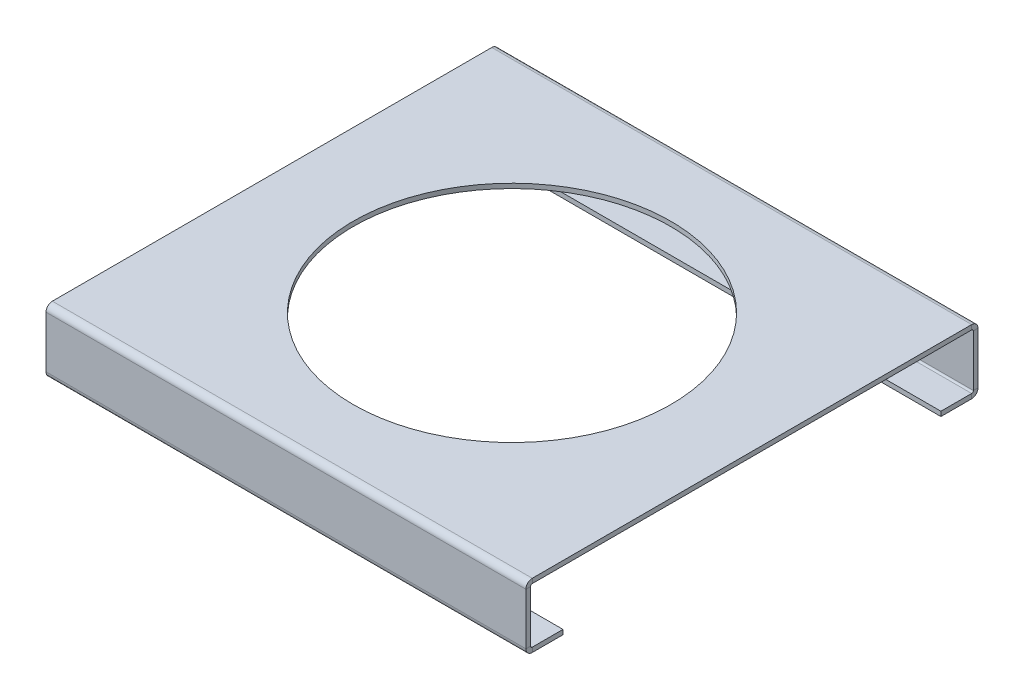
ISO-10303-21;
HEADER;
FILE_DESCRIPTION(('STEP AP214'),'2;1');
FILE_NAME('part.step','',(''),(''),'','','');
FILE_SCHEMA(('AUTOMOTIVE_DESIGN { 1 0 10303 214 1 1 1 1 }'));
ENDSEC;
DATA;
#1=APPLICATION_CONTEXT('core data for automotive mechanical design processes');
#2=APPLICATION_PROTOCOL_DEFINITION('international standard','automotive_design',2000,#1);
#3=PRODUCT_CONTEXT('',#1,'mechanical');
#4=PRODUCT('Part','Part','',(#3));
#5=PRODUCT_RELATED_PRODUCT_CATEGORY('part','',(#4));
#6=PRODUCT_DEFINITION_FORMATION('','',#4);
#7=PRODUCT_DEFINITION_CONTEXT('part definition',#1,'design');
#8=PRODUCT_DEFINITION('design','',#6,#7);
#9=PRODUCT_DEFINITION_SHAPE('','',#8);
#10=(LENGTH_UNIT() NAMED_UNIT(*) SI_UNIT(.MILLI.,.METRE.));
#11=(NAMED_UNIT(*) PLANE_ANGLE_UNIT() SI_UNIT($,.RADIAN.));
#12=(NAMED_UNIT(*) SI_UNIT($,.STERADIAN.) SOLID_ANGLE_UNIT());
#13=UNCERTAINTY_MEASURE_WITH_UNIT(LENGTH_MEASURE(1.E-05),#10,'distance_accuracy_value','');
#14=(GEOMETRIC_REPRESENTATION_CONTEXT(3) GLOBAL_UNCERTAINTY_ASSIGNED_CONTEXT((#13)) GLOBAL_UNIT_ASSIGNED_CONTEXT((#10,
#11,#12)) REPRESENTATION_CONTEXT('',''));
#15=CARTESIAN_POINT('',(0.,0.,0.));
#16=DIRECTION('',(0.,0.,1.));
#17=DIRECTION('',(1.,0.,0.));
#18=AXIS2_PLACEMENT_3D('',#15,#16,#17);
#19=CARTESIAN_POINT('',(0.,-2.,0.));
#20=DIRECTION('',(0.,1.,0.));
#21=DIRECTION('',(0.,0.,1.));
#22=AXIS2_PLACEMENT_3D('',#19,#20,#21);
#23=PLANE('',#22);
#24=CARTESIAN_POINT('',(-1.35489248208037,-2.,0.135489248208026));
#25=DIRECTION('',(0.,1.,0.));
#26=DIRECTION('',(0.,0.,1.));
#27=AXIS2_PLACEMENT_3D('',#24,#25,#26);
#28=CIRCLE('',#27,68.5);
#29=CARTESIAN_POINT('',(-1.35489248208037,-2.,68.635489248208));
#30=VERTEX_POINT('',#29);
#31=EDGE_CURVE('E353',#30,#30,#28,.T.);
#32=ORIENTED_EDGE('',*,*,#31,.T.);
#33=EDGE_LOOP('',(#32));
#34=FACE_BOUND('',#33,.T.);
#35=DIRECTION('',(1.,0.,0.));
#36=VECTOR('',#35,1.);
#37=CARTESIAN_POINT('',(102.14510751792,-2.00000000000001,-94.627910751792));
#38=LINE('',#37,#36);
#39=CARTESIAN_POINT('',(102.14510751792,-2.00000000000001,-94.627910751792));
#40=VERTEX_POINT('',#39);
#41=CARTESIAN_POINT('',(-104.85489248208,-2.00000000000001,-94.627910751792));
#42=VERTEX_POINT('',#41);
#43=EDGE_CURVE('E402',#40,#42,#38,.F.);
#44=ORIENTED_EDGE('',*,*,#43,.F.);
#45=DIRECTION('',(0.,0.,-1.));
#46=VECTOR('',#45,1.);
#47=CARTESIAN_POINT('',(102.14510751792,-2.,97.635489248208));
#48=LINE('',#47,#46);
#49=CARTESIAN_POINT('',(102.14510751792,-2.00000000000001,94.898889248208));
#50=VERTEX_POINT('',#49);
#51=EDGE_CURVE('E126',#50,#40,#48,.T.);
#52=ORIENTED_EDGE('',*,*,#51,.F.);
#53=DIRECTION('',(-1.,0.,0.));
#54=VECTOR('',#53,1.);
#55=CARTESIAN_POINT('',(-104.85489248208,-2.00000000000001,94.898889248208));
#56=LINE('',#55,#54);
#57=CARTESIAN_POINT('',(-104.85489248208,-2.00000000000001,94.898889248208));
#58=VERTEX_POINT('',#57);
#59=EDGE_CURVE('E454',#58,#50,#56,.F.);
#60=ORIENTED_EDGE('',*,*,#59,.F.);
#61=DIRECTION('',(0.,0.,1.));
#62=VECTOR('',#61,1.);
#63=CARTESIAN_POINT('',(-104.85489248208,-2.,-97.364510751792));
#64=LINE('',#63,#62);
#65=EDGE_CURVE('E13',#42,#58,#64,.T.);
#66=ORIENTED_EDGE('',*,*,#65,.F.);
#67=EDGE_LOOP('',(#44,#52,#60,#66));
#68=FACE_BOUND('',#67,.T.);
#69=ADVANCED_FACE('F117',(#34,#68),#23,.F.);
#70=CARTESIAN_POINT('',(0.,0.,0.));
#71=DIRECTION('',(0.,1.,0.));
#72=DIRECTION('',(0.,0.,1.));
#73=AXIS2_PLACEMENT_3D('',#70,#71,#72);
#74=PLANE('',#73);
#75=CARTESIAN_POINT('',(-1.35489248208037,0.,0.135489248208026));
#76=DIRECTION('',(0.,1.,0.));
#77=DIRECTION('',(0.,0.,1.));
#78=AXIS2_PLACEMENT_3D('',#75,#76,#77);
#79=CIRCLE('',#78,68.5);
#80=CARTESIAN_POINT('',(-1.35489248208037,0.,68.635489248208));
#81=VERTEX_POINT('',#80);
#82=EDGE_CURVE('E344',#81,#81,#79,.T.);
#83=ORIENTED_EDGE('',*,*,#82,.F.);
#84=EDGE_LOOP('',(#83));
#85=FACE_BOUND('',#84,.T.);
#86=DIRECTION('',(0.,0.,-1.));
#87=VECTOR('',#86,1.);
#88=CARTESIAN_POINT('',(102.14510751792,0.,97.635489248208));
#89=LINE('',#88,#87);
#90=CARTESIAN_POINT('',(102.14510751792,0.,94.898889248208));
#91=VERTEX_POINT('',#90);
#92=CARTESIAN_POINT('',(102.14510751792,0.,-94.627910751792));
#93=VERTEX_POINT('',#92);
#94=EDGE_CURVE('E460',#91,#93,#89,.T.);
#95=ORIENTED_EDGE('',*,*,#94,.T.);
#96=DIRECTION('',(1.,0.,0.));
#97=VECTOR('',#96,1.);
#98=CARTESIAN_POINT('',(102.14510751792,0.,-94.627910751792));
#99=LINE('',#98,#97);
#100=CARTESIAN_POINT('',(-104.85489248208,0.,-94.627910751792));
#101=VERTEX_POINT('',#100);
#102=EDGE_CURVE('E391',#93,#101,#99,.F.);
#103=ORIENTED_EDGE('',*,*,#102,.T.);
#104=DIRECTION('',(0.,0.,1.));
#105=VECTOR('',#104,1.);
#106=CARTESIAN_POINT('',(-104.85489248208,0.,-97.364510751792));
#107=LINE('',#106,#105);
#108=CARTESIAN_POINT('',(-104.85489248208,0.,94.898889248208));
#109=VERTEX_POINT('',#108);
#110=EDGE_CURVE('E121',#101,#109,#107,.T.);
#111=ORIENTED_EDGE('',*,*,#110,.T.);
#112=DIRECTION('',(-1.,0.,0.));
#113=VECTOR('',#112,1.);
#114=CARTESIAN_POINT('',(-104.85489248208,0.,94.898889248208));
#115=LINE('',#114,#113);
#116=EDGE_CURVE('E443',#109,#91,#115,.F.);
#117=ORIENTED_EDGE('',*,*,#116,.T.);
#118=EDGE_LOOP('',(#95,#103,#111,#117));
#119=FACE_BOUND('',#118,.T.);
#120=ADVANCED_FACE('F469',(#85,#119),#74,.T.);
#121=CARTESIAN_POINT('',(102.14510751792,-2.,97.635489248208));
#122=DIRECTION('',(1.,0.,0.));
#123=DIRECTION('',(0.,0.,-1.));
#124=AXIS2_PLACEMENT_3D('',#121,#122,#123);
#125=PLANE('',#124);
#126=ORIENTED_EDGE('',*,*,#51,.T.);
#127=DIRECTION('',(0.,1.,0.));
#128=VECTOR('',#127,1.);
#129=CARTESIAN_POINT('',(102.14510751792,-2.00000000000001,-94.627910751792));
#130=LINE('',#129,#128);
#131=EDGE_CURVE('E396',#40,#93,#130,.T.);
#132=ORIENTED_EDGE('',*,*,#131,.T.);
#133=ORIENTED_EDGE('',*,*,#94,.F.);
#134=DIRECTION('',(0.,1.,0.));
#135=VECTOR('',#134,1.);
#136=CARTESIAN_POINT('',(102.14510751792,-2.00000000000001,94.898889248208));
#137=LINE('',#136,#135);
#138=EDGE_CURVE('E458',#50,#91,#137,.T.);
#139=ORIENTED_EDGE('',*,*,#138,.F.);
#140=EDGE_LOOP('',(#126,#132,#133,#139));
#141=FACE_BOUND('',#140,.T.);
#142=ADVANCED_FACE('F119',(#141),#125,.T.);
#143=CARTESIAN_POINT('',(-104.85489248208,-2.,-97.364510751792));
#144=DIRECTION('',(-1.,0.,0.));
#145=DIRECTION('',(0.,0.,1.));
#146=AXIS2_PLACEMENT_3D('',#143,#144,#145);
#147=PLANE('',#146);
#148=DIRECTION('',(0.,1.,0.));
#149=VECTOR('',#148,1.);
#150=CARTESIAN_POINT('',(-104.85489248208,-2.00000000000001,-94.627910751792));
#151=LINE('',#150,#149);
#152=EDGE_CURVE('E406',#42,#101,#151,.T.);
#153=ORIENTED_EDGE('',*,*,#152,.F.);
#154=ORIENTED_EDGE('',*,*,#65,.T.);
#155=DIRECTION('',(0.,1.,0.));
#156=VECTOR('',#155,1.);
#157=CARTESIAN_POINT('',(-104.85489248208,-2.00000000000001,94.898889248208));
#158=LINE('',#157,#156);
#159=EDGE_CURVE('E448',#58,#109,#158,.T.);
#160=ORIENTED_EDGE('',*,*,#159,.T.);
#161=ORIENTED_EDGE('',*,*,#110,.F.);
#162=EDGE_LOOP('',(#153,#154,#160,#161));
#163=FACE_BOUND('',#162,.T.);
#164=ADVANCED_FACE('F472',(#163),#147,.T.);
#165=CARTESIAN_POINT('',(102.14510751792,-2.73660000000001,94.898889248208));
#166=DIRECTION('',(1.,0.,0.));
#167=DIRECTION('',(0.,0.,-1.));
#168=AXIS2_PLACEMENT_3D('',#165,#166,#167);
#169=PLANE('',#168);
#170=DIRECTION('',(0.,0.,-1.));
#171=VECTOR('',#170,1.);
#172=CARTESIAN_POINT('',(102.14510751792,-2.73660000000001,97.635489248208));
#173=LINE('',#172,#171);
#174=CARTESIAN_POINT('',(102.14510751792,-2.73660000000001,95.635489248208));
#175=VERTEX_POINT('',#174);
#176=CARTESIAN_POINT('',(102.14510751792,-2.7366,97.635489248208));
#177=VERTEX_POINT('',#176);
#178=EDGE_CURVE('E408',#175,#177,#173,.F.);
#179=ORIENTED_EDGE('',*,*,#178,.F.);
#180=CARTESIAN_POINT('',(102.14510751792,-2.73660000000001,94.898889248208));
#181=DIRECTION('',(-1.,0.,0.));
#182=DIRECTION('',(0.,0.,1.));
#183=AXIS2_PLACEMENT_3D('',#180,#181,#182);
#184=CIRCLE('',#183,0.736600000000004);
#185=EDGE_CURVE('E451',#50,#175,#184,.F.);
#186=ORIENTED_EDGE('',*,*,#185,.F.);
#187=ORIENTED_EDGE('',*,*,#138,.T.);
#188=CARTESIAN_POINT('',(102.14510751792,-2.73660000000001,94.898889248208));
#189=DIRECTION('',(-1.,0.,0.));
#190=DIRECTION('',(0.,0.,1.));
#191=AXIS2_PLACEMENT_3D('',#188,#189,#190);
#192=CIRCLE('',#191,2.7366);
#193=EDGE_CURVE('E134',#91,#177,#192,.F.);
#194=ORIENTED_EDGE('',*,*,#193,.T.);
#195=EDGE_LOOP('',(#179,#186,#187,#194));
#196=FACE_BOUND('',#195,.T.);
#197=ADVANCED_FACE('F550',(#196),#169,.T.);
#198=CARTESIAN_POINT('',(-104.85489248208,-2.73660000000001,94.898889248208));
#199=DIRECTION('',(1.,0.,0.));
#200=DIRECTION('',(0.,0.,-1.));
#201=AXIS2_PLACEMENT_3D('',#198,#199,#200);
#202=PLANE('',#201);
#203=CARTESIAN_POINT('',(-104.85489248208,-2.73660000000001,94.898889248208));
#204=DIRECTION('',(-1.,0.,0.));
#205=DIRECTION('',(0.,0.,1.));
#206=AXIS2_PLACEMENT_3D('',#203,#204,#205);
#207=CIRCLE('',#206,0.736600000000004);
#208=CARTESIAN_POINT('',(-104.85489248208,-2.73660000000001,95.635489248208));
#209=VERTEX_POINT('',#208);
#210=EDGE_CURVE('E413',#209,#58,#207,.T.);
#211=ORIENTED_EDGE('',*,*,#210,.F.);
#212=DIRECTION('',(0.,0.,-1.));
#213=VECTOR('',#212,1.);
#214=CARTESIAN_POINT('',(-104.85489248208,-2.73660000000002,95.635489248208));
#215=LINE('',#214,#213);
#216=CARTESIAN_POINT('',(-104.85489248208,-2.73660000000002,97.635489248208));
#217=VERTEX_POINT('',#216);
#218=EDGE_CURVE('E436',#209,#217,#215,.F.);
#219=ORIENTED_EDGE('',*,*,#218,.T.);
#220=CARTESIAN_POINT('',(-104.85489248208,-2.73660000000001,94.898889248208));
#221=DIRECTION('',(-1.,0.,0.));
#222=DIRECTION('',(0.,0.,1.));
#223=AXIS2_PLACEMENT_3D('',#220,#221,#222);
#224=CIRCLE('',#223,2.7366);
#225=EDGE_CURVE('E446',#217,#109,#224,.T.);
#226=ORIENTED_EDGE('',*,*,#225,.T.);
#227=ORIENTED_EDGE('',*,*,#159,.F.);
#228=EDGE_LOOP('',(#211,#219,#226,#227));
#229=FACE_BOUND('',#228,.T.);
#230=ADVANCED_FACE('F477',(#229),#202,.F.);
#231=CARTESIAN_POINT('',(-104.85489248208,-2.73660000000001,94.898889248208));
#232=DIRECTION('',(-1.,0.,0.));
#233=DIRECTION('',(0.,0.,1.));
#234=AXIS2_PLACEMENT_3D('',#231,#232,#233);
#235=CYLINDRICAL_SURFACE('',#234,2.7366);
#236=ORIENTED_EDGE('',*,*,#116,.F.);
#237=ORIENTED_EDGE('',*,*,#225,.F.);
#238=DIRECTION('',(-1.,0.,0.));
#239=VECTOR('',#238,1.);
#240=CARTESIAN_POINT('',(102.14510751792,-2.73660000000001,97.635489248208));
#241=LINE('',#240,#239);
#242=EDGE_CURVE('E434',#217,#177,#241,.F.);
#243=ORIENTED_EDGE('',*,*,#242,.T.);
#244=ORIENTED_EDGE('',*,*,#193,.F.);
#245=EDGE_LOOP('',(#236,#237,#243,#244));
#246=FACE_BOUND('',#245,.T.);
#247=ADVANCED_FACE('F631',(#246),#235,.T.);
#248=CARTESIAN_POINT('',(-104.85489248208,-2.73660000000001,94.898889248208));
#249=DIRECTION('',(-1.,0.,0.));
#250=DIRECTION('',(0.,0.,1.));
#251=AXIS2_PLACEMENT_3D('',#248,#249,#250);
#252=CYLINDRICAL_SURFACE('',#251,0.736600000000004);
#253=ORIENTED_EDGE('',*,*,#59,.T.);
#254=ORIENTED_EDGE('',*,*,#185,.T.);
#255=DIRECTION('',(-1.,0.,0.));
#256=VECTOR('',#255,1.);
#257=CARTESIAN_POINT('',(102.14510751792,-2.73660000000001,95.635489248208));
#258=LINE('',#257,#256);
#259=EDGE_CURVE('E439',#175,#209,#258,.T.);
#260=ORIENTED_EDGE('',*,*,#259,.T.);
#261=ORIENTED_EDGE('',*,*,#210,.T.);
#262=EDGE_LOOP('',(#253,#254,#260,#261));
#263=FACE_BOUND('',#262,.T.);
#264=ADVANCED_FACE('F480',(#263),#252,.F.);
#265=CARTESIAN_POINT('',(-104.85489248208,-25.,97.6354892482081));
#266=DIRECTION('',(1.,0.,0.));
#267=DIRECTION('',(0.,0.,-1.));
#268=AXIS2_PLACEMENT_3D('',#265,#266,#267);
#269=PLANE('',#268);
#270=ORIENTED_EDGE('',*,*,#218,.F.);
#271=DIRECTION('',(0.,1.,0.));
#272=VECTOR('',#271,1.);
#273=CARTESIAN_POINT('',(-104.85489248208,-25.,95.6354892482081));
#274=LINE('',#273,#272);
#275=CARTESIAN_POINT('',(-104.85489248208,-25.,95.6354892482081));
#276=VERTEX_POINT('',#275);
#277=EDGE_CURVE('E431',#209,#276,#274,.F.);
#278=ORIENTED_EDGE('',*,*,#277,.T.);
#279=DIRECTION('',(0.,0.,-1.));
#280=VECTOR('',#279,1.);
#281=CARTESIAN_POINT('',(-104.85489248208,-25.,97.6354892482081));
#282=LINE('',#281,#280);
#283=CARTESIAN_POINT('',(-104.85489248208,-25.,97.6354892482081));
#284=VERTEX_POINT('',#283);
#285=EDGE_CURVE('E411',#284,#276,#282,.T.);
#286=ORIENTED_EDGE('',*,*,#285,.F.);
#287=DIRECTION('',(0.,-1.,0.));
#288=VECTOR('',#287,1.);
#289=CARTESIAN_POINT('',(-104.85489248208,3.60451989364325E-13,97.635489248208));
#290=LINE('',#289,#288);
#291=EDGE_CURVE('E423',#217,#284,#290,.T.);
#292=ORIENTED_EDGE('',*,*,#291,.F.);
#293=EDGE_LOOP('',(#270,#278,#286,#292));
#294=FACE_BOUND('',#293,.T.);
#295=ADVANCED_FACE('F627',(#294),#269,.F.);
#296=CARTESIAN_POINT('',(102.14510751792,-1.99999999999999,97.635489248208));
#297=DIRECTION('',(-1.,0.,0.));
#298=DIRECTION('',(0.,0.,1.));
#299=AXIS2_PLACEMENT_3D('',#296,#297,#298);
#300=PLANE('',#299);
#301=ORIENTED_EDGE('',*,*,#178,.T.);
#302=DIRECTION('',(0.,1.,0.));
#303=VECTOR('',#302,1.);
#304=CARTESIAN_POINT('',(102.14510751792,3.60451989364325E-13,97.635489248208));
#305=LINE('',#304,#303);
#306=CARTESIAN_POINT('',(102.14510751792,-25.,97.6354892482081));
#307=VERTEX_POINT('',#306);
#308=EDGE_CURVE('E417',#307,#177,#305,.T.);
#309=ORIENTED_EDGE('',*,*,#308,.F.);
#310=DIRECTION('',(0.,0.,-1.));
#311=VECTOR('',#310,1.);
#312=CARTESIAN_POINT('',(102.14510751792,-25.,97.6354892482081));
#313=LINE('',#312,#311);
#314=CARTESIAN_POINT('',(102.14510751792,-25.,95.6354892482081));
#315=VERTEX_POINT('',#314);
#316=EDGE_CURVE('E414',#307,#315,#313,.T.);
#317=ORIENTED_EDGE('',*,*,#316,.T.);
#318=DIRECTION('',(0.,-1.,0.));
#319=VECTOR('',#318,1.);
#320=CARTESIAN_POINT('',(102.14510751792,-2.,95.635489248208));
#321=LINE('',#320,#319);
#322=EDGE_CURVE('E426',#315,#175,#321,.F.);
#323=ORIENTED_EDGE('',*,*,#322,.T.);
#324=EDGE_LOOP('',(#301,#309,#317,#323));
#325=FACE_BOUND('',#324,.T.);
#326=ADVANCED_FACE('F489',(#325),#300,.F.);
#327=CARTESIAN_POINT('',(0.,3.60451989364325E-13,97.635489248208));
#328=DIRECTION('',(0.,0.,-1.));
#329=DIRECTION('',(0.,1.,0.));
#330=AXIS2_PLACEMENT_3D('',#327,#328,#329);
#331=PLANE('',#330);
#332=ORIENTED_EDGE('',*,*,#242,.F.);
#333=ORIENTED_EDGE('',*,*,#291,.T.);
#334=DIRECTION('',(1.,0.,0.));
#335=VECTOR('',#334,1.);
#336=CARTESIAN_POINT('',(0.,-25.,97.6354892482081));
#337=LINE('',#336,#335);
#338=EDGE_CURVE('E420',#284,#307,#337,.T.);
#339=ORIENTED_EDGE('',*,*,#338,.T.);
#340=ORIENTED_EDGE('',*,*,#308,.T.);
#341=EDGE_LOOP('',(#332,#333,#339,#340));
#342=FACE_BOUND('',#341,.T.);
#343=ADVANCED_FACE('F497',(#342),#331,.F.);
#344=CARTESIAN_POINT('',(0.,3.53469026686638E-13,95.635489248208));
#345=DIRECTION('',(0.,0.,-1.));
#346=DIRECTION('',(0.,1.,0.));
#347=AXIS2_PLACEMENT_3D('',#344,#345,#346);
#348=PLANE('',#347);
#349=ORIENTED_EDGE('',*,*,#277,.F.);
#350=ORIENTED_EDGE('',*,*,#259,.F.);
#351=ORIENTED_EDGE('',*,*,#322,.F.);
#352=DIRECTION('',(-1.,0.,0.));
#353=VECTOR('',#352,1.);
#354=CARTESIAN_POINT('',(102.14510751792,-25.,95.6354892482081));
#355=LINE('',#354,#353);
#356=EDGE_CURVE('E429',#276,#315,#355,.F.);
#357=ORIENTED_EDGE('',*,*,#356,.F.);
#358=EDGE_LOOP('',(#349,#350,#351,#357));
#359=FACE_BOUND('',#358,.T.);
#360=ADVANCED_FACE('F486',(#359),#348,.T.);
#361=CARTESIAN_POINT('',(-104.85489248208,-2.73660000000001,-94.627910751792));
#362=DIRECTION('',(-1.,0.,0.));
#363=DIRECTION('',(0.,0.,1.));
#364=AXIS2_PLACEMENT_3D('',#361,#362,#363);
#365=PLANE('',#364);
#366=DIRECTION('',(0.,0.,1.));
#367=VECTOR('',#366,1.);
#368=CARTESIAN_POINT('',(-104.85489248208,-2.73659999999999,-97.364510751792));
#369=LINE('',#368,#367);
#370=CARTESIAN_POINT('',(-104.85489248208,-2.73660000000001,-95.364510751792));
#371=VERTEX_POINT('',#370);
#372=CARTESIAN_POINT('',(-104.85489248208,-2.7366,-97.364510751792));
#373=VERTEX_POINT('',#372);
#374=EDGE_CURVE('E356',#371,#373,#369,.F.);
#375=ORIENTED_EDGE('',*,*,#374,.F.);
#376=CARTESIAN_POINT('',(-104.85489248208,-2.73660000000001,-94.627910751792));
#377=DIRECTION('',(1.,0.,0.));
#378=DIRECTION('',(0.,0.,-1.));
#379=AXIS2_PLACEMENT_3D('',#376,#377,#378);
#380=CIRCLE('',#379,0.736600000000004);
#381=EDGE_CURVE('E399',#42,#371,#380,.F.);
#382=ORIENTED_EDGE('',*,*,#381,.F.);
#383=ORIENTED_EDGE('',*,*,#152,.T.);
#384=CARTESIAN_POINT('',(-104.85489248208,-2.73660000000001,-94.627910751792));
#385=DIRECTION('',(1.,0.,0.));
#386=DIRECTION('',(0.,0.,-1.));
#387=AXIS2_PLACEMENT_3D('',#384,#385,#386);
#388=CIRCLE('',#387,2.7366);
#389=EDGE_CURVE('E142',#101,#373,#388,.F.);
#390=ORIENTED_EDGE('',*,*,#389,.T.);
#391=EDGE_LOOP('',(#375,#382,#383,#390));
#392=FACE_BOUND('',#391,.T.);
#393=ADVANCED_FACE('F568',(#392),#365,.T.);
#394=CARTESIAN_POINT('',(102.14510751792,-2.73660000000001,-94.627910751792));
#395=DIRECTION('',(-1.,0.,0.));
#396=DIRECTION('',(0.,0.,1.));
#397=AXIS2_PLACEMENT_3D('',#394,#395,#396);
#398=PLANE('',#397);
#399=CARTESIAN_POINT('',(102.14510751792,-2.73660000000001,-94.627910751792));
#400=DIRECTION('',(1.,0.,0.));
#401=DIRECTION('',(0.,0.,-1.));
#402=AXIS2_PLACEMENT_3D('',#399,#400,#401);
#403=CIRCLE('',#402,0.736600000000004);
#404=CARTESIAN_POINT('',(102.14510751792,-2.73660000000001,-95.364510751792));
#405=VERTEX_POINT('',#404);
#406=EDGE_CURVE('E361',#405,#40,#403,.T.);
#407=ORIENTED_EDGE('',*,*,#406,.F.);
#408=DIRECTION('',(0.,0.,1.));
#409=VECTOR('',#408,1.);
#410=CARTESIAN_POINT('',(102.14510751792,-2.73660000000001,-95.364510751792));
#411=LINE('',#410,#409);
#412=CARTESIAN_POINT('',(102.14510751792,-2.73659999999999,-97.364510751792));
#413=VERTEX_POINT('',#412);
#414=EDGE_CURVE('E384',#405,#413,#411,.F.);
#415=ORIENTED_EDGE('',*,*,#414,.T.);
#416=CARTESIAN_POINT('',(102.14510751792,-2.73660000000001,-94.627910751792));
#417=DIRECTION('',(1.,0.,0.));
#418=DIRECTION('',(0.,0.,-1.));
#419=AXIS2_PLACEMENT_3D('',#416,#417,#418);
#420=CIRCLE('',#419,2.7366);
#421=EDGE_CURVE('E394',#413,#93,#420,.T.);
#422=ORIENTED_EDGE('',*,*,#421,.T.);
#423=ORIENTED_EDGE('',*,*,#131,.F.);
#424=EDGE_LOOP('',(#407,#415,#422,#423));
#425=FACE_BOUND('',#424,.T.);
#426=ADVANCED_FACE('F601',(#425),#398,.F.);
#427=CARTESIAN_POINT('',(102.14510751792,-2.73660000000001,-94.627910751792));
#428=DIRECTION('',(1.,0.,0.));
#429=DIRECTION('',(0.,0.,-1.));
#430=AXIS2_PLACEMENT_3D('',#427,#428,#429);
#431=CYLINDRICAL_SURFACE('',#430,2.7366);
#432=ORIENTED_EDGE('',*,*,#102,.F.);
#433=ORIENTED_EDGE('',*,*,#421,.F.);
#434=DIRECTION('',(1.,0.,0.));
#435=VECTOR('',#434,1.);
#436=CARTESIAN_POINT('',(-104.85489248208,-2.73659999999999,-97.364510751792));
#437=LINE('',#436,#435);
#438=EDGE_CURVE('E382',#413,#373,#437,.F.);
#439=ORIENTED_EDGE('',*,*,#438,.T.);
#440=ORIENTED_EDGE('',*,*,#389,.F.);
#441=EDGE_LOOP('',(#432,#433,#439,#440));
#442=FACE_BOUND('',#441,.T.);
#443=ADVANCED_FACE('F611',(#442),#431,.T.);
#444=CARTESIAN_POINT('',(102.14510751792,-2.73660000000001,-94.627910751792));
#445=DIRECTION('',(1.,0.,0.));
#446=DIRECTION('',(0.,0.,-1.));
#447=AXIS2_PLACEMENT_3D('',#444,#445,#446);
#448=CYLINDRICAL_SURFACE('',#447,0.736600000000004);
#449=ORIENTED_EDGE('',*,*,#43,.T.);
#450=ORIENTED_EDGE('',*,*,#381,.T.);
#451=DIRECTION('',(1.,0.,0.));
#452=VECTOR('',#451,1.);
#453=CARTESIAN_POINT('',(-104.85489248208,-2.73660000000001,-95.364510751792));
#454=LINE('',#453,#452);
#455=EDGE_CURVE('E387',#371,#405,#454,.T.);
#456=ORIENTED_EDGE('',*,*,#455,.T.);
#457=ORIENTED_EDGE('',*,*,#406,.T.);
#458=EDGE_LOOP('',(#449,#450,#456,#457));
#459=FACE_BOUND('',#458,.T.);
#460=ADVANCED_FACE('F564',(#459),#448,.F.);
#461=CARTESIAN_POINT('',(102.14510751792,-25.,-97.3645107517921));
#462=DIRECTION('',(-1.,0.,0.));
#463=DIRECTION('',(0.,0.,1.));
#464=AXIS2_PLACEMENT_3D('',#461,#462,#463);
#465=PLANE('',#464);
#466=ORIENTED_EDGE('',*,*,#414,.F.);
#467=DIRECTION('',(0.,1.,0.));
#468=VECTOR('',#467,1.);
#469=CARTESIAN_POINT('',(102.14510751792,-25.,-95.3645107517921));
#470=LINE('',#469,#468);
#471=CARTESIAN_POINT('',(102.14510751792,-25.,-95.3645107517921));
#472=VERTEX_POINT('',#471);
#473=EDGE_CURVE('E379',#405,#472,#470,.F.);
#474=ORIENTED_EDGE('',*,*,#473,.T.);
#475=DIRECTION('',(0.,0.,1.));
#476=VECTOR('',#475,1.);
#477=CARTESIAN_POINT('',(102.14510751792,-25.,-97.3645107517921));
#478=LINE('',#477,#476);
#479=CARTESIAN_POINT('',(102.14510751792,-25.,-97.3645107517921));
#480=VERTEX_POINT('',#479);
#481=EDGE_CURVE('E359',#480,#472,#478,.T.);
#482=ORIENTED_EDGE('',*,*,#481,.F.);
#483=DIRECTION('',(0.,-1.,0.));
#484=VECTOR('',#483,1.);
#485=CARTESIAN_POINT('',(102.14510751792,3.59470967953783E-13,-97.364510751792));
#486=LINE('',#485,#484);
#487=EDGE_CURVE('E371',#413,#480,#486,.T.);
#488=ORIENTED_EDGE('',*,*,#487,.F.);
#489=EDGE_LOOP('',(#466,#474,#482,#488));
#490=FACE_BOUND('',#489,.T.);
#491=ADVANCED_FACE('F603',(#490),#465,.F.);
#492=CARTESIAN_POINT('',(-104.85489248208,-1.99999999999999,-97.364510751792));
#493=DIRECTION('',(1.,0.,0.));
#494=DIRECTION('',(0.,0.,-1.));
#495=AXIS2_PLACEMENT_3D('',#492,#493,#494);
#496=PLANE('',#495);
#497=ORIENTED_EDGE('',*,*,#374,.T.);
#498=DIRECTION('',(0.,1.,0.));
#499=VECTOR('',#498,1.);
#500=CARTESIAN_POINT('',(-104.85489248208,3.59470967953783E-13,-97.364510751792));
#501=LINE('',#500,#499);
#502=CARTESIAN_POINT('',(-104.85489248208,-25.,-97.3645107517921));
#503=VERTEX_POINT('',#502);
#504=EDGE_CURVE('E365',#503,#373,#501,.T.);
#505=ORIENTED_EDGE('',*,*,#504,.F.);
#506=DIRECTION('',(0.,0.,1.));
#507=VECTOR('',#506,1.);
#508=CARTESIAN_POINT('',(-104.85489248208,-25.,-97.3645107517921));
#509=LINE('',#508,#507);
#510=CARTESIAN_POINT('',(-104.85489248208,-25.,-95.3645107517921));
#511=VERTEX_POINT('',#510);
#512=EDGE_CURVE('E362',#503,#511,#509,.T.);
#513=ORIENTED_EDGE('',*,*,#512,.T.);
#514=DIRECTION('',(0.,-1.,0.));
#515=VECTOR('',#514,1.);
#516=CARTESIAN_POINT('',(-104.85489248208,-2.,-95.364510751792));
#517=LINE('',#516,#515);
#518=EDGE_CURVE('E374',#511,#371,#517,.F.);
#519=ORIENTED_EDGE('',*,*,#518,.T.);
#520=EDGE_LOOP('',(#497,#505,#513,#519));
#521=FACE_BOUND('',#520,.T.);
#522=ADVANCED_FACE('F571',(#521),#496,.F.);
#523=CARTESIAN_POINT('',(0.,3.59470967953783E-13,-97.364510751792));
#524=DIRECTION('',(0.,0.,1.));
#525=DIRECTION('',(0.,-1.,0.));
#526=AXIS2_PLACEMENT_3D('',#523,#524,#525);
#527=PLANE('',#526);
#528=ORIENTED_EDGE('',*,*,#438,.F.);
#529=ORIENTED_EDGE('',*,*,#487,.T.);
#530=DIRECTION('',(-1.,0.,0.));
#531=VECTOR('',#530,1.);
#532=CARTESIAN_POINT('',(0.,-25.,-97.3645107517921));
#533=LINE('',#532,#531);
#534=EDGE_CURVE('E368',#480,#503,#533,.T.);
#535=ORIENTED_EDGE('',*,*,#534,.T.);
#536=ORIENTED_EDGE('',*,*,#504,.T.);
#537=EDGE_LOOP('',(#528,#529,#535,#536));
#538=FACE_BOUND('',#537,.T.);
#539=ADVANCED_FACE('F575',(#538),#527,.F.);
#540=CARTESIAN_POINT('',(0.,3.52488005276097E-13,-95.364510751792));
#541=DIRECTION('',(0.,0.,1.));
#542=DIRECTION('',(0.,-1.,0.));
#543=AXIS2_PLACEMENT_3D('',#540,#541,#542);
#544=PLANE('',#543);
#545=ORIENTED_EDGE('',*,*,#473,.F.);
#546=ORIENTED_EDGE('',*,*,#455,.F.);
#547=ORIENTED_EDGE('',*,*,#518,.F.);
#548=DIRECTION('',(1.,0.,0.));
#549=VECTOR('',#548,1.);
#550=CARTESIAN_POINT('',(-104.85489248208,-25.,-95.3645107517921));
#551=LINE('',#550,#549);
#552=EDGE_CURVE('E377',#472,#511,#551,.F.);
#553=ORIENTED_EDGE('',*,*,#552,.F.);
#554=EDGE_LOOP('',(#545,#546,#547,#553));
#555=FACE_BOUND('',#554,.T.);
#556=ADVANCED_FACE('F598',(#555),#544,.T.);
#557=CARTESIAN_POINT('',(-1.35489248208037,-2.,0.135489248208026));
#558=DIRECTION('',(0.,1.,0.));
#559=DIRECTION('',(0.,0.,1.));
#560=AXIS2_PLACEMENT_3D('',#557,#558,#559);
#561=CYLINDRICAL_SURFACE('',#560,68.5);
#562=ORIENTED_EDGE('',*,*,#31,.F.);
#563=EDGE_LOOP('',(#562));
#564=FACE_BOUND('',#563,.T.);
#565=ORIENTED_EDGE('',*,*,#82,.T.);
#566=EDGE_LOOP('',(#565));
#567=FACE_BOUND('',#566,.T.);
#568=ADVANCED_FACE('F693',(#564,#567),#561,.F.);
#569=CARTESIAN_POINT('',(102.14510751792,-25.,94.8988892482081));
#570=DIRECTION('',(1.,0.,0.));
#571=DIRECTION('',(0.,0.,-1.));
#572=AXIS2_PLACEMENT_3D('',#569,#570,#571);
#573=PLANE('',#572);
#574=DIRECTION('',(0.,1.,0.));
#575=VECTOR('',#574,1.);
#576=CARTESIAN_POINT('',(102.14510751792,-27.7366,94.8988892482081));
#577=LINE('',#576,#575);
#578=CARTESIAN_POINT('',(102.14510751792,-25.7366,94.8988892482081));
#579=VERTEX_POINT('',#578);
#580=CARTESIAN_POINT('',(102.145107517919,-27.7366,94.8988892482081));
#581=VERTEX_POINT('',#580);
#582=EDGE_CURVE('E301',#579,#581,#577,.F.);
#583=ORIENTED_EDGE('',*,*,#582,.F.);
#584=CARTESIAN_POINT('',(102.14510751792,-25.,94.8988892482081));
#585=DIRECTION('',(-1.,0.,0.));
#586=DIRECTION('',(0.,0.,1.));
#587=AXIS2_PLACEMENT_3D('',#584,#585,#586);
#588=CIRCLE('',#587,0.736599999999997);
#589=EDGE_CURVE('E348',#315,#579,#588,.F.);
#590=ORIENTED_EDGE('',*,*,#589,.F.);
#591=ORIENTED_EDGE('',*,*,#316,.F.);
#592=CARTESIAN_POINT('',(102.145107517919,-25.,94.8988892482081));
#593=DIRECTION('',(-1.,0.,0.));
#594=DIRECTION('',(0.,0.,1.));
#595=AXIS2_PLACEMENT_3D('',#592,#593,#594);
#596=CIRCLE('',#595,2.7366);
#597=EDGE_CURVE('E341',#307,#581,#596,.F.);
#598=ORIENTED_EDGE('',*,*,#597,.T.);
#599=EDGE_LOOP('',(#583,#590,#591,#598));
#600=FACE_BOUND('',#599,.T.);
#601=ADVANCED_FACE('F494',(#600),#573,.T.);
#602=CARTESIAN_POINT('',(-104.85489248208,-25.,94.8988892482081));
#603=DIRECTION('',(1.,0.,0.));
#604=DIRECTION('',(0.,0.,-1.));
#605=AXIS2_PLACEMENT_3D('',#602,#603,#604);
#606=PLANE('',#605);
#607=CARTESIAN_POINT('',(-104.85489248208,-25.,94.8988892482081));
#608=DIRECTION('',(-1.,0.,0.));
#609=DIRECTION('',(0.,0.,1.));
#610=AXIS2_PLACEMENT_3D('',#607,#608,#609);
#611=CIRCLE('',#610,0.736599999999997);
#612=CARTESIAN_POINT('',(-104.85489248208,-25.7366,94.8988892482081));
#613=VERTEX_POINT('',#612);
#614=EDGE_CURVE('E314',#613,#276,#611,.T.);
#615=ORIENTED_EDGE('',*,*,#614,.F.);
#616=DIRECTION('',(0.,1.,0.));
#617=VECTOR('',#616,1.);
#618=CARTESIAN_POINT('',(-104.85489248208,-25.7366,94.8988892482081));
#619=LINE('',#618,#617);
#620=CARTESIAN_POINT('',(-104.85489248208,-27.7366,94.8988892482081));
#621=VERTEX_POINT('',#620);
#622=EDGE_CURVE('E334',#613,#621,#619,.F.);
#623=ORIENTED_EDGE('',*,*,#622,.T.);
#624=CARTESIAN_POINT('',(-104.85489248208,-25.,94.8988892482081));
#625=DIRECTION('',(-1.,0.,0.));
#626=DIRECTION('',(0.,0.,1.));
#627=AXIS2_PLACEMENT_3D('',#624,#625,#626);
#628=CIRCLE('',#627,2.7366);
#629=EDGE_CURVE('E345',#621,#284,#628,.T.);
#630=ORIENTED_EDGE('',*,*,#629,.T.);
#631=ORIENTED_EDGE('',*,*,#285,.T.);
#632=EDGE_LOOP('',(#615,#623,#630,#631));
#633=FACE_BOUND('',#632,.T.);
#634=ADVANCED_FACE('F504',(#633),#606,.F.);
#635=CARTESIAN_POINT('',(-104.85489248208,-25.,94.8988892482081));
#636=DIRECTION('',(-1.,0.,0.));
#637=DIRECTION('',(0.,-1.,0.));
#638=AXIS2_PLACEMENT_3D('',#635,#636,#637);
#639=CYLINDRICAL_SURFACE('',#638,2.7366);
#640=ORIENTED_EDGE('',*,*,#338,.F.);
#641=ORIENTED_EDGE('',*,*,#629,.F.);
#642=DIRECTION('',(-1.,0.,0.));
#643=VECTOR('',#642,1.);
#644=CARTESIAN_POINT('',(102.14510751792,-27.7366,94.8988892482081));
#645=LINE('',#644,#643);
#646=EDGE_CURVE('E332',#621,#581,#645,.F.);
#647=ORIENTED_EDGE('',*,*,#646,.T.);
#648=ORIENTED_EDGE('',*,*,#597,.F.);
#649=EDGE_LOOP('',(#640,#641,#647,#648));
#650=FACE_BOUND('',#649,.T.);
#651=ADVANCED_FACE('F501',(#650),#639,.T.);
#652=CARTESIAN_POINT('',(-104.85489248208,-25.,94.8988892482081));
#653=DIRECTION('',(-1.,0.,0.));
#654=DIRECTION('',(0.,-1.,0.));
#655=AXIS2_PLACEMENT_3D('',#652,#653,#654);
#656=CYLINDRICAL_SURFACE('',#655,0.736599999999997);
#657=ORIENTED_EDGE('',*,*,#356,.T.);
#658=ORIENTED_EDGE('',*,*,#589,.T.);
#659=DIRECTION('',(-1.,0.,0.));
#660=VECTOR('',#659,1.);
#661=CARTESIAN_POINT('',(102.14510751792,-25.7366,94.8988892482081));
#662=LINE('',#661,#660);
#663=EDGE_CURVE('E337',#579,#613,#662,.T.);
#664=ORIENTED_EDGE('',*,*,#663,.T.);
#665=ORIENTED_EDGE('',*,*,#614,.T.);
#666=EDGE_LOOP('',(#657,#658,#664,#665));
#667=FACE_BOUND('',#666,.T.);
#668=ADVANCED_FACE('F525',(#667),#656,.F.);
#669=CARTESIAN_POINT('',(-104.85489248208,-27.7366000000001,81.6354892482082));
#670=DIRECTION('',(1.,0.,0.));
#671=DIRECTION('',(0.,0.,-1.));
#672=AXIS2_PLACEMENT_3D('',#669,#670,#671);
#673=PLANE('',#672);
#674=ORIENTED_EDGE('',*,*,#622,.F.);
#675=DIRECTION('',(0.,0.,1.));
#676=VECTOR('',#675,1.);
#677=CARTESIAN_POINT('',(-104.85489248208,-25.7366000000001,81.6354892482081));
#678=LINE('',#677,#676);
#679=CARTESIAN_POINT('',(-104.85489248208,-25.7366000000001,81.6354892482081));
#680=VERTEX_POINT('',#679);
#681=EDGE_CURVE('E330',#613,#680,#678,.F.);
#682=ORIENTED_EDGE('',*,*,#681,.T.);
#683=DIRECTION('',(0.,1.,0.));
#684=VECTOR('',#683,1.);
#685=CARTESIAN_POINT('',(-104.85489248208,-27.7366000000001,81.6354892482082));
#686=LINE('',#685,#684);
#687=CARTESIAN_POINT('',(-104.85489248208,-27.7366000000001,81.6354892482082));
#688=VERTEX_POINT('',#687);
#689=EDGE_CURVE('E311',#688,#680,#686,.T.);
#690=ORIENTED_EDGE('',*,*,#689,.F.);
#691=DIRECTION('',(0.,0.,-1.));
#692=VECTOR('',#691,1.);
#693=CARTESIAN_POINT('',(-104.85489248208,-27.7366000000007,1.96558043638795E-13));
#694=LINE('',#693,#692);
#695=EDGE_CURVE('E323',#621,#688,#694,.T.);
#696=ORIENTED_EDGE('',*,*,#695,.F.);
#697=EDGE_LOOP('',(#674,#682,#690,#696));
#698=FACE_BOUND('',#697,.T.);
#699=ADVANCED_FACE('F514',(#698),#673,.F.);
#700=CARTESIAN_POINT('',(102.14510751792,-27.7366,95.6354892482081));
#701=DIRECTION('',(-1.,0.,0.));
#702=DIRECTION('',(0.,0.,1.));
#703=AXIS2_PLACEMENT_3D('',#700,#701,#702);
#704=PLANE('',#703);
#705=ORIENTED_EDGE('',*,*,#582,.T.);
#706=DIRECTION('',(0.,0.,1.));
#707=VECTOR('',#706,1.);
#708=CARTESIAN_POINT('',(102.14510751792,-27.7366000000007,1.96558043638795E-13));
#709=LINE('',#708,#707);
#710=CARTESIAN_POINT('',(102.14510751792,-27.7366000000001,81.6354892482082));
#711=VERTEX_POINT('',#710);
#712=EDGE_CURVE('E318',#711,#581,#709,.T.);
#713=ORIENTED_EDGE('',*,*,#712,.F.);
#714=DIRECTION('',(0.,1.,0.));
#715=VECTOR('',#714,1.);
#716=CARTESIAN_POINT('',(102.14510751792,-27.7366000000001,81.6354892482082));
#717=LINE('',#716,#715);
#718=CARTESIAN_POINT('',(102.14510751792,-25.7366000000001,81.6354892482081));
#719=VERTEX_POINT('',#718);
#720=EDGE_CURVE('E315',#711,#719,#717,.T.);
#721=ORIENTED_EDGE('',*,*,#720,.T.);
#722=DIRECTION('',(0.,0.,-1.));
#723=VECTOR('',#722,1.);
#724=CARTESIAN_POINT('',(102.14510751792,-25.7366,95.6354892482081));
#725=LINE('',#724,#723);
#726=EDGE_CURVE('E325',#719,#579,#725,.F.);
#727=ORIENTED_EDGE('',*,*,#726,.T.);
#728=EDGE_LOOP('',(#705,#713,#721,#727));
#729=FACE_BOUND('',#728,.T.);
#730=ADVANCED_FACE('F522',(#729),#704,.F.);
#731=CARTESIAN_POINT('',(0.,-27.7366000000007,1.96558043638795E-13));
#732=DIRECTION('',(0.,1.,0.));
#733=DIRECTION('',(0.,0.,1.));
#734=AXIS2_PLACEMENT_3D('',#731,#732,#733);
#735=PLANE('',#734);
#736=ORIENTED_EDGE('',*,*,#646,.F.);
#737=ORIENTED_EDGE('',*,*,#695,.T.);
#738=DIRECTION('',(1.,0.,0.));
#739=VECTOR('',#738,1.);
#740=CARTESIAN_POINT('',(0.,-27.7366000000001,81.6354892482082));
#741=LINE('',#740,#739);
#742=EDGE_CURVE('E321',#688,#711,#741,.T.);
#743=ORIENTED_EDGE('',*,*,#742,.T.);
#744=ORIENTED_EDGE('',*,*,#712,.T.);
#745=EDGE_LOOP('',(#736,#737,#743,#744));
#746=FACE_BOUND('',#745,.T.);
#747=ADVANCED_FACE('F511',(#746),#735,.F.);
#748=CARTESIAN_POINT('',(0.,-25.7366000000007,1.82334496017901E-13));
#749=DIRECTION('',(0.,1.,0.));
#750=DIRECTION('',(0.,0.,1.));
#751=AXIS2_PLACEMENT_3D('',#748,#749,#750);
#752=PLANE('',#751);
#753=ORIENTED_EDGE('',*,*,#681,.F.);
#754=ORIENTED_EDGE('',*,*,#663,.F.);
#755=ORIENTED_EDGE('',*,*,#726,.F.);
#756=DIRECTION('',(-1.,0.,0.));
#757=VECTOR('',#756,1.);
#758=CARTESIAN_POINT('',(102.14510751792,-25.7366000000001,81.6354892482081));
#759=LINE('',#758,#757);
#760=EDGE_CURVE('E328',#680,#719,#759,.F.);
#761=ORIENTED_EDGE('',*,*,#760,.F.);
#762=EDGE_LOOP('',(#753,#754,#755,#761));
#763=FACE_BOUND('',#762,.T.);
#764=ADVANCED_FACE('F527',(#763),#752,.T.);
#765=CARTESIAN_POINT('',(102.14510751792,-27.7366000000001,81.6354892482082));
#766=DIRECTION('',(0.,0.,1.));
#767=DIRECTION('',(0.,-1.,0.));
#768=AXIS2_PLACEMENT_3D('',#765,#766,#767);
#769=PLANE('',#768);
#770=ORIENTED_EDGE('',*,*,#760,.T.);
#771=ORIENTED_EDGE('',*,*,#720,.F.);
#772=ORIENTED_EDGE('',*,*,#742,.F.);
#773=ORIENTED_EDGE('',*,*,#689,.T.);
#774=EDGE_LOOP('',(#770,#771,#772,#773));
#775=FACE_BOUND('',#774,.T.);
#776=ADVANCED_FACE('F519',(#775),#769,.F.);
#777=CARTESIAN_POINT('',(-104.85489248208,-25.,-94.6279107517921));
#778=DIRECTION('',(-1.,0.,0.));
#779=DIRECTION('',(0.,0.,1.));
#780=AXIS2_PLACEMENT_3D('',#777,#778,#779);
#781=PLANE('',#780);
#782=DIRECTION('',(0.,1.,0.));
#783=VECTOR('',#782,1.);
#784=CARTESIAN_POINT('',(-104.85489248208,-27.7366,-94.6279107517921));
#785=LINE('',#784,#783);
#786=CARTESIAN_POINT('',(-104.85489248208,-25.7366,-94.6279107517921));
#787=VERTEX_POINT('',#786);
#788=CARTESIAN_POINT('',(-104.85489248208,-27.7366,-94.6279107517921));
#789=VERTEX_POINT('',#788);
#790=EDGE_CURVE('E280',#787,#789,#785,.F.);
#791=ORIENTED_EDGE('',*,*,#790,.F.);
#792=CARTESIAN_POINT('',(-104.85489248208,-25.,-94.6279107517921));
#793=DIRECTION('',(1.,0.,0.));
#794=DIRECTION('',(0.,0.,-1.));
#795=AXIS2_PLACEMENT_3D('',#792,#793,#794);
#796=CIRCLE('',#795,0.736599999999997);
#797=EDGE_CURVE('E305',#511,#787,#796,.F.);
#798=ORIENTED_EDGE('',*,*,#797,.F.);
#799=ORIENTED_EDGE('',*,*,#512,.F.);
#800=CARTESIAN_POINT('',(-104.85489248208,-25.,-94.6279107517921));
#801=DIRECTION('',(1.,0.,0.));
#802=DIRECTION('',(0.,0.,-1.));
#803=AXIS2_PLACEMENT_3D('',#800,#801,#802);
#804=CIRCLE('',#803,2.7366);
#805=EDGE_CURVE('E298',#503,#789,#804,.F.);
#806=ORIENTED_EDGE('',*,*,#805,.T.);
#807=EDGE_LOOP('',(#791,#798,#799,#806));
#808=FACE_BOUND('',#807,.T.);
#809=ADVANCED_FACE('F534',(#808),#781,.T.);
#810=CARTESIAN_POINT('',(102.14510751792,-25.,-94.6279107517921));
#811=DIRECTION('',(-1.,0.,0.));
#812=DIRECTION('',(0.,0.,1.));
#813=AXIS2_PLACEMENT_3D('',#810,#811,#812);
#814=PLANE('',#813);
#815=CARTESIAN_POINT('',(102.14510751792,-25.,-94.6279107517921));
#816=DIRECTION('',(1.,0.,0.));
#817=DIRECTION('',(0.,0.,-1.));
#818=AXIS2_PLACEMENT_3D('',#815,#816,#817);
#819=CIRCLE('',#818,0.736599999999997);
#820=CARTESIAN_POINT('',(102.14510751792,-25.7366,-94.6279107517921));
#821=VERTEX_POINT('',#820);
#822=EDGE_CURVE('E308',#821,#472,#819,.T.);
#823=ORIENTED_EDGE('',*,*,#822,.F.);
#824=DIRECTION('',(0.,1.,0.));
#825=VECTOR('',#824,1.);
#826=CARTESIAN_POINT('',(102.14510751792,-25.7366,-94.6279107517921));
#827=LINE('',#826,#825);
#828=CARTESIAN_POINT('',(102.14510751792,-27.7366,-94.6279107517921));
#829=VERTEX_POINT('',#828);
#830=EDGE_CURVE('E292',#821,#829,#827,.F.);
#831=ORIENTED_EDGE('',*,*,#830,.T.);
#832=CARTESIAN_POINT('',(102.14510751792,-25.,-94.6279107517921));
#833=DIRECTION('',(1.,0.,0.));
#834=DIRECTION('',(0.,0.,-1.));
#835=AXIS2_PLACEMENT_3D('',#832,#833,#834);
#836=CIRCLE('',#835,2.7366);
#837=EDGE_CURVE('E302',#829,#480,#836,.T.);
#838=ORIENTED_EDGE('',*,*,#837,.T.);
#839=ORIENTED_EDGE('',*,*,#481,.T.);
#840=EDGE_LOOP('',(#823,#831,#838,#839));
#841=FACE_BOUND('',#840,.T.);
#842=ADVANCED_FACE('F583',(#841),#814,.F.);
#843=CARTESIAN_POINT('',(102.14510751792,-25.,-94.6279107517921));
#844=DIRECTION('',(1.,0.,0.));
#845=DIRECTION('',(0.,-1.,0.));
#846=AXIS2_PLACEMENT_3D('',#843,#844,#845);
#847=CYLINDRICAL_SURFACE('',#846,2.7366);
#848=ORIENTED_EDGE('',*,*,#534,.F.);
#849=ORIENTED_EDGE('',*,*,#837,.F.);
#850=DIRECTION('',(1.,0.,0.));
#851=VECTOR('',#850,1.);
#852=CARTESIAN_POINT('',(-104.85489248208,-27.7366,-94.6279107517921));
#853=LINE('',#852,#851);
#854=EDGE_CURVE('E290',#829,#789,#853,.F.);
#855=ORIENTED_EDGE('',*,*,#854,.T.);
#856=ORIENTED_EDGE('',*,*,#805,.F.);
#857=EDGE_LOOP('',(#848,#849,#855,#856));
#858=FACE_BOUND('',#857,.T.);
#859=ADVANCED_FACE('F579',(#858),#847,.T.);
#860=CARTESIAN_POINT('',(102.14510751792,-25.,-94.6279107517921));
#861=DIRECTION('',(1.,0.,0.));
#862=DIRECTION('',(0.,-1.,0.));
#863=AXIS2_PLACEMENT_3D('',#860,#861,#862);
#864=CYLINDRICAL_SURFACE('',#863,0.736599999999997);
#865=ORIENTED_EDGE('',*,*,#552,.T.);
#866=ORIENTED_EDGE('',*,*,#797,.T.);
#867=DIRECTION('',(1.,0.,0.));
#868=VECTOR('',#867,1.);
#869=CARTESIAN_POINT('',(-104.85489248208,-25.7366,-94.6279107517921));
#870=LINE('',#869,#868);
#871=EDGE_CURVE('E295',#787,#821,#870,.T.);
#872=ORIENTED_EDGE('',*,*,#871,.T.);
#873=ORIENTED_EDGE('',*,*,#822,.T.);
#874=EDGE_LOOP('',(#865,#866,#872,#873));
#875=FACE_BOUND('',#874,.T.);
#876=ADVANCED_FACE('F592',(#875),#864,.F.);
#877=CARTESIAN_POINT('',(102.14510751792,-27.7366000000001,-81.3645107517921));
#878=DIRECTION('',(-1.,0.,0.));
#879=DIRECTION('',(0.,0.,1.));
#880=AXIS2_PLACEMENT_3D('',#877,#878,#879);
#881=PLANE('',#880);
#882=ORIENTED_EDGE('',*,*,#830,.F.);
#883=DIRECTION('',(0.,0.,-1.));
#884=VECTOR('',#883,1.);
#885=CARTESIAN_POINT('',(102.14510751792,-25.7366000000001,-81.3645107517921));
#886=LINE('',#885,#884);
#887=CARTESIAN_POINT('',(102.14510751792,-25.7366000000001,-81.3645107517921));
#888=VERTEX_POINT('',#887);
#889=EDGE_CURVE('E288',#821,#888,#886,.F.);
#890=ORIENTED_EDGE('',*,*,#889,.T.);
#891=DIRECTION('',(0.,1.,0.));
#892=VECTOR('',#891,1.);
#893=CARTESIAN_POINT('',(102.14510751792,-27.7366000000001,-81.3645107517921));
#894=LINE('',#893,#892);
#895=CARTESIAN_POINT('',(102.14510751792,-27.7366000000001,-81.3645107517921));
#896=VERTEX_POINT('',#895);
#897=EDGE_CURVE('E276',#896,#888,#894,.T.);
#898=ORIENTED_EDGE('',*,*,#897,.F.);
#899=DIRECTION('',(0.,0.,1.));
#900=VECTOR('',#899,1.);
#901=CARTESIAN_POINT('',(102.14510751792,-27.7366000000007,-1.96558043638795E-13));
#902=LINE('',#901,#900);
#903=EDGE_CURVE('E263',#829,#896,#902,.T.);
#904=ORIENTED_EDGE('',*,*,#903,.F.);
#905=EDGE_LOOP('',(#882,#890,#898,#904));
#906=FACE_BOUND('',#905,.T.);
#907=ADVANCED_FACE('F587',(#906),#881,.F.);
#908=CARTESIAN_POINT('',(-104.85489248208,-27.7366,-95.3645107517921));
#909=DIRECTION('',(1.,0.,0.));
#910=DIRECTION('',(0.,0.,-1.));
#911=AXIS2_PLACEMENT_3D('',#908,#909,#910);
#912=PLANE('',#911);
#913=ORIENTED_EDGE('',*,*,#790,.T.);
#914=DIRECTION('',(0.,0.,-1.));
#915=VECTOR('',#914,1.);
#916=CARTESIAN_POINT('',(-104.85489248208,-27.7366000000007,-1.96558043638795E-13));
#917=LINE('',#916,#915);
#918=CARTESIAN_POINT('',(-104.85489248208,-27.7366000000001,-81.3645107517921));
#919=VERTEX_POINT('',#918);
#920=EDGE_CURVE('E261',#919,#789,#917,.T.);
#921=ORIENTED_EDGE('',*,*,#920,.F.);
#922=DIRECTION('',(0.,1.,0.));
#923=VECTOR('',#922,1.);
#924=CARTESIAN_POINT('',(-104.85489248208,-27.7366000000001,-81.3645107517921));
#925=LINE('',#924,#923);
#926=CARTESIAN_POINT('',(-104.85489248208,-25.7366000000001,-81.3645107517921));
#927=VERTEX_POINT('',#926);
#928=EDGE_CURVE('E269',#919,#927,#925,.T.);
#929=ORIENTED_EDGE('',*,*,#928,.T.);
#930=DIRECTION('',(0.,0.,1.));
#931=VECTOR('',#930,1.);
#932=CARTESIAN_POINT('',(-104.85489248208,-25.7366,-95.3645107517921));
#933=LINE('',#932,#931);
#934=EDGE_CURVE('E285',#927,#787,#933,.F.);
#935=ORIENTED_EDGE('',*,*,#934,.T.);
#936=EDGE_LOOP('',(#913,#921,#929,#935));
#937=FACE_BOUND('',#936,.T.);
#938=ADVANCED_FACE('F279',(#937),#912,.F.);
#939=CARTESIAN_POINT('',(0.,-27.7366000000007,-1.96558043638795E-13));
#940=DIRECTION('',(0.,1.,0.));
#941=DIRECTION('',(0.,0.,1.));
#942=AXIS2_PLACEMENT_3D('',#939,#940,#941);
#943=PLANE('',#942);
#944=ORIENTED_EDGE('',*,*,#854,.F.);
#945=ORIENTED_EDGE('',*,*,#903,.T.);
#946=DIRECTION('',(-1.,0.,0.));
#947=VECTOR('',#946,1.);
#948=CARTESIAN_POINT('',(0.,-27.7366000000001,-81.3645107517921));
#949=LINE('',#948,#947);
#950=EDGE_CURVE('E256',#896,#919,#949,.T.);
#951=ORIENTED_EDGE('',*,*,#950,.T.);
#952=ORIENTED_EDGE('',*,*,#920,.T.);
#953=EDGE_LOOP('',(#944,#945,#951,#952));
#954=FACE_BOUND('',#953,.T.);
#955=ADVANCED_FACE('F259',(#954),#943,.F.);
#956=CARTESIAN_POINT('',(0.,-25.7366000000007,-1.82334496017901E-13));
#957=DIRECTION('',(0.,1.,0.));
#958=DIRECTION('',(0.,0.,1.));
#959=AXIS2_PLACEMENT_3D('',#956,#957,#958);
#960=PLANE('',#959);
#961=ORIENTED_EDGE('',*,*,#889,.F.);
#962=ORIENTED_EDGE('',*,*,#871,.F.);
#963=ORIENTED_EDGE('',*,*,#934,.F.);
#964=DIRECTION('',(1.,0.,0.));
#965=VECTOR('',#964,1.);
#966=CARTESIAN_POINT('',(-104.85489248208,-25.7366000000001,-81.3645107517921));
#967=LINE('',#966,#965);
#968=EDGE_CURVE('E272',#888,#927,#967,.F.);
#969=ORIENTED_EDGE('',*,*,#968,.F.);
#970=EDGE_LOOP('',(#961,#962,#963,#969));
#971=FACE_BOUND('',#970,.T.);
#972=ADVANCED_FACE('F590',(#971),#960,.T.);
#973=CARTESIAN_POINT('',(-104.85489248208,-27.7366000000001,-81.3645107517921));
#974=DIRECTION('',(0.,0.,-1.));
#975=DIRECTION('',(0.,1.,0.));
#976=AXIS2_PLACEMENT_3D('',#973,#974,#975);
#977=PLANE('',#976);
#978=ORIENTED_EDGE('',*,*,#968,.T.);
#979=ORIENTED_EDGE('',*,*,#928,.F.);
#980=ORIENTED_EDGE('',*,*,#950,.F.);
#981=ORIENTED_EDGE('',*,*,#897,.T.);
#982=EDGE_LOOP('',(#978,#979,#980,#981));
#983=FACE_BOUND('',#982,.T.);
#984=ADVANCED_FACE('F270',(#983),#977,.F.);
#985=CLOSED_SHELL('',(#69,#120,#142,#164,#197,#230,#247,#264,#295,#326,#343,#360,#393,#426,#443,
#460,#491,#522,#539,#556,#568,#601,#634,#651,#668,#699,#730,#747,#764,#776,#809,#842,#859,#876,
#907,#938,#955,#972,#984));
#986=MANIFOLD_SOLID_BREP('B2',#985);
#987=ADVANCED_BREP_SHAPE_REPRESENTATION('',(#18,#986),#14);
#988=SHAPE_DEFINITION_REPRESENTATION(#9,#987);
ENDSEC;
END-ISO-10303-21;
